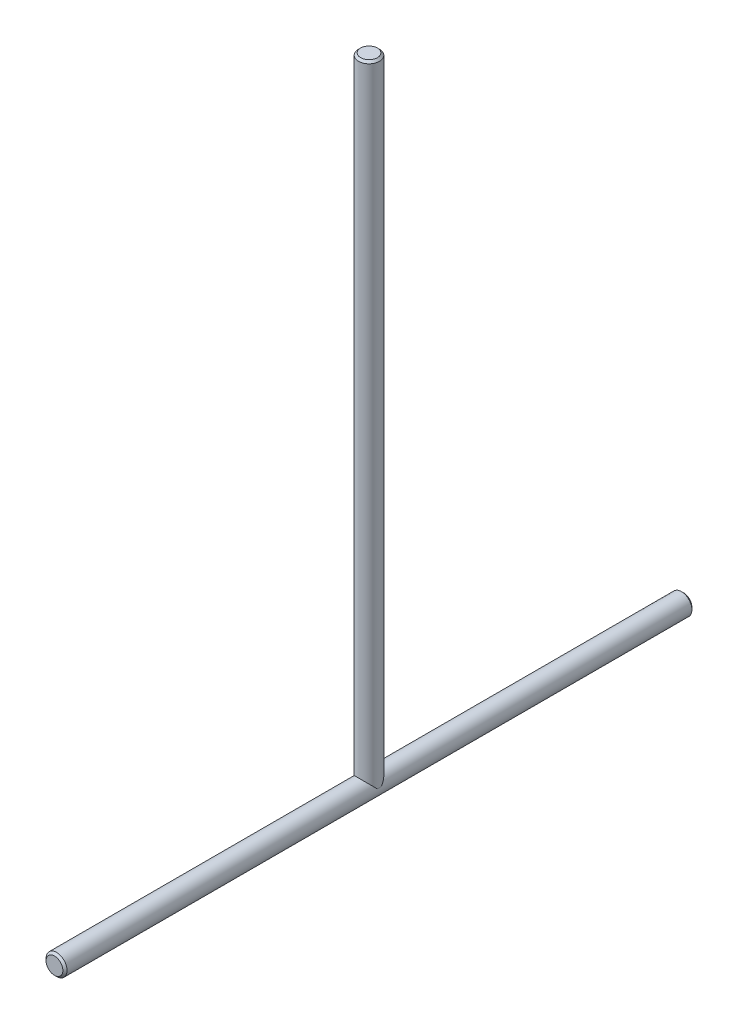
ISO-10303-21;
HEADER;
FILE_DESCRIPTION(('STEP AP214'),'2;1');
FILE_NAME('part.step','',(''),(''),'','','');
FILE_SCHEMA(('AUTOMOTIVE_DESIGN { 1 0 10303 214 1 1 1 1 }'));
ENDSEC;
DATA;
#1=APPLICATION_CONTEXT('core data for automotive mechanical design processes');
#2=APPLICATION_PROTOCOL_DEFINITION('international standard','automotive_design',2000,#1);
#3=PRODUCT_CONTEXT('',#1,'mechanical');
#4=PRODUCT('Part','Part','',(#3));
#5=PRODUCT_RELATED_PRODUCT_CATEGORY('part','',(#4));
#6=PRODUCT_DEFINITION_FORMATION('','',#4);
#7=PRODUCT_DEFINITION_CONTEXT('part definition',#1,'design');
#8=PRODUCT_DEFINITION('design','',#6,#7);
#9=PRODUCT_DEFINITION_SHAPE('','',#8);
#10=(LENGTH_UNIT() NAMED_UNIT(*) SI_UNIT(.MILLI.,.METRE.));
#11=(NAMED_UNIT(*) PLANE_ANGLE_UNIT() SI_UNIT($,.RADIAN.));
#12=(NAMED_UNIT(*) SI_UNIT($,.STERADIAN.) SOLID_ANGLE_UNIT());
#13=UNCERTAINTY_MEASURE_WITH_UNIT(LENGTH_MEASURE(1.E-05),#10,'distance_accuracy_value','');
#14=(GEOMETRIC_REPRESENTATION_CONTEXT(3) GLOBAL_UNCERTAINTY_ASSIGNED_CONTEXT((#13)) GLOBAL_UNIT_ASSIGNED_CONTEXT((#10,
#11,#12)) REPRESENTATION_CONTEXT('',''));
#15=CARTESIAN_POINT('',(0.,0.,0.));
#16=DIRECTION('',(0.,0.,1.));
#17=DIRECTION('',(1.,0.,0.));
#18=AXIS2_PLACEMENT_3D('',#15,#16,#17);
#19=CARTESIAN_POINT('',(0.,0.,0.));
#20=DIRECTION('',(0.,-1.,0.));
#21=DIRECTION('',(0.,0.,-1.));
#22=AXIS2_PLACEMENT_3D('',#19,#20,#21);
#23=CYLINDRICAL_SURFACE('',#22,4.99999999999999);
#24=CARTESIAN_POINT('',(0.,301.,0.));
#25=DIRECTION('',(0.,-1.,0.));
#26=DIRECTION('',(0.,0.,-1.));
#27=AXIS2_PLACEMENT_3D('',#24,#25,#26);
#28=CIRCLE('',#27,5.00000000000002);
#29=CARTESIAN_POINT('',(0.,301.,-5.00000000000002));
#30=VERTEX_POINT('',#29);
#31=EDGE_CURVE('E73',#30,#30,#28,.T.);
#32=ORIENTED_EDGE('',*,*,#31,.T.);
#33=EDGE_LOOP('',(#32));
#34=FACE_BOUND('',#33,.T.);
#35=CARTESIAN_POINT('',(0.,1.,0.));
#36=DIRECTION('',(0.,-1.,0.));
#37=DIRECTION('',(0.,0.,-1.));
#38=AXIS2_PLACEMENT_3D('',#35,#36,#37);
#39=CIRCLE('',#38,4.99999999999996);
#40=CARTESIAN_POINT('',(4.89897948556633,1.,-1.));
#41=VERTEX_POINT('',#40);
#42=CARTESIAN_POINT('',(4.89897948556633,1.,1.));
#43=VERTEX_POINT('',#42);
#44=EDGE_CURVE('E69',#41,#43,#39,.T.);
#45=ORIENTED_EDGE('',*,*,#44,.F.);
#46=CARTESIAN_POINT('',(0.,0.,0.));
#47=DIRECTION('',(0.,-0.707106781186547,-0.707106781186547));
#48=DIRECTION('',(0.,-0.707106781186547,0.707106781186547));
#49=AXIS2_PLACEMENT_3D('',#46,#47,#48);
#50=ELLIPSE('',#49,7.07106781186547,5.);
#51=CARTESIAN_POINT('',(-4.89897948556636,1.,-0.999999999999816));
#52=VERTEX_POINT('',#51);
#53=EDGE_CURVE('E52',#41,#52,#50,.F.);
#54=ORIENTED_EDGE('',*,*,#53,.T.);
#55=CARTESIAN_POINT('',(-4.89897948556636,1.,0.999999999999816));
#56=VERTEX_POINT('',#55);
#57=EDGE_CURVE('E67',#56,#52,#39,.T.);
#58=ORIENTED_EDGE('',*,*,#57,.F.);
#59=CARTESIAN_POINT('',(0.,0.,0.));
#60=DIRECTION('',(0.,-0.707106781186547,0.707106781186547));
#61=DIRECTION('',(0.,-0.707106781186547,-0.707106781186547));
#62=AXIS2_PLACEMENT_3D('',#59,#60,#61);
#63=ELLIPSE('',#62,7.07106781186547,5.);
#64=EDGE_CURVE('E47',#56,#43,#63,.F.);
#65=ORIENTED_EDGE('',*,*,#64,.T.);
#66=EDGE_LOOP('',(#45,#54,#58,#65));
#67=FACE_BOUND('',#66,.T.);
#68=ADVANCED_FACE('F32',(#34,#67),#23,.T.);
#69=CARTESIAN_POINT('',(0.,0.,0.));
#70=DIRECTION('',(0.,1.,0.));
#71=DIRECTION('',(0.,0.,1.));
#72=AXIS2_PLACEMENT_3D('',#69,#70,#71);
#73=CONICAL_SURFACE('',#72,3.99999999999997,0.785398163397446);
#74=ORIENTED_EDGE('',*,*,#44,.T.);
#75=CARTESIAN_POINT('',(4.87745424991357,1.10020000000002,1.49079847061895));
#76=CARTESIAN_POINT('',(4.88211559722487,1.07953217280684,1.40484180989072));
#77=CARTESIAN_POINT('',(4.88630399811169,1.06035627995717,1.31850437199833));
#78=CARTESIAN_POINT('',(4.89378874480552,1.02525776660876,1.14511017585227));
#79=CARTESIAN_POINT('',(4.89708485523737,1.00933600478034,1.05805323403131));
#80=CARTESIAN_POINT('',(4.90571535378677,0.966856273344412,0.795840807345466));
#81=CARTESIAN_POINT('',(4.90978700435332,0.945606699696971,0.619736392432964));
#82=CARTESIAN_POINT('',(4.91480123161804,0.919189776996474,0.270032854404587));
#83=CARTESIAN_POINT('',(4.91580821010439,0.91369157238792,0.0964595921330885));
#84=CARTESIAN_POINT('',(4.91495449459275,0.918275850826598,-0.250368988003878));
#85=CARTESIAN_POINT('',(4.91309596686564,0.928346564068938,-0.423624447010351));
#86=CARTESIAN_POINT('',(4.90827213698644,0.953369752381306,-0.671073171390941));
#87=CARTESIAN_POINT('',(4.90652484958276,0.962352257723393,-0.745947233075276));
#88=CARTESIAN_POINT('',(4.90243629319782,0.982970675049836,-0.895311289612724));
#89=CARTESIAN_POINT('',(4.90009507487671,0.994606360718969,-0.969801316669958));
#90=CARTESIAN_POINT('',(4.89476658555269,1.02050779519384,-1.11902541731952));
#91=CARTESIAN_POINT('',(4.8917733907918,1.03479746967753,-1.19375509139308));
#92=CARTESIAN_POINT('',(4.8851213416845,1.06575707574376,-1.34268562643545));
#93=CARTESIAN_POINT('',(4.8814625308798,1.08242685161504,-1.41688652166494));
#94=CARTESIAN_POINT('',(4.87745424991358,1.1002,-1.49079847061889));
#95=B_SPLINE_CURVE_WITH_KNOTS('',3,(#75,#76,#77,#78,#79,#80,#81,#82,#83,#84,#85,#86,#87,#88,#89,
#90,#91,#92,#93,#94),.UNSPECIFIED.,.F.,.F.,(4,2,2,2,2,2,2,2,2,4),(0.,0.26556121911636,
0.531192421882955,1.062740701676,1.58303896616567,2.102944087393,2.32920031111436,
2.55543724248506,2.7838225042531,3.01219283141514),.UNSPECIFIED.);
#96=EDGE_CURVE('E62',#43,#41,#95,.T.);
#97=ORIENTED_EDGE('',*,*,#96,.T.);
#98=EDGE_LOOP('',(#74,#97));
#99=FACE_BOUND('',#98,.T.);
#100=ADVANCED_FACE('F89',(#99),#73,.T.);
#101=ORIENTED_EDGE('',*,*,#57,.T.);
#102=CARTESIAN_POINT('',(-4.87745424991358,1.1002,-1.49079847061889));
#103=CARTESIAN_POINT('',(-4.88211559722487,1.07953217280683,-1.40484180989066));
#104=CARTESIAN_POINT('',(-4.88630399811169,1.06035627995715,-1.31850437199826));
#105=CARTESIAN_POINT('',(-4.89378874480552,1.02525776660875,-1.14511017585221));
#106=CARTESIAN_POINT('',(-4.89708485523737,1.00933600478033,-1.05805323403125));
#107=CARTESIAN_POINT('',(-4.90571535378678,0.966856273344404,-0.795840807345409));
#108=CARTESIAN_POINT('',(-4.90978700435332,0.945606699696964,-0.619736392432908));
#109=CARTESIAN_POINT('',(-4.91480123161804,0.919189776996472,-0.270032854404534));
#110=CARTESIAN_POINT('',(-4.91580821010439,0.91369157238792,-0.0964595921330372));
#111=CARTESIAN_POINT('',(-4.91495449459275,0.9182758508266,0.250368988003926));
#112=CARTESIAN_POINT('',(-4.91309596686564,0.92834656406894,0.423624447010397));
#113=CARTESIAN_POINT('',(-4.90827213698644,0.95336975238131,0.671073171390987));
#114=CARTESIAN_POINT('',(-4.90652484958276,0.962352257723399,0.745947233075324));
#115=CARTESIAN_POINT('',(-4.90243629319782,0.982970675049844,0.895311289612774));
#116=CARTESIAN_POINT('',(-4.90009507487671,0.994606360718978,0.96980131667001));
#117=CARTESIAN_POINT('',(-4.89476658555269,1.02050779519385,1.11902541731958));
#118=CARTESIAN_POINT('',(-4.8917733907918,1.03479746967754,1.19375509139314));
#119=CARTESIAN_POINT('',(-4.88512134168449,1.06575707574377,1.34268562643551));
#120=CARTESIAN_POINT('',(-4.8814625308798,1.08242685161505,1.41688652166501));
#121=CARTESIAN_POINT('',(-4.87745424991357,1.10020000000002,1.49079847061896));
#122=B_SPLINE_CURVE_WITH_KNOTS('',3,(#102,#103,#104,#105,#106,#107,#108,#109,#110,#111,#112,
#113,#114,#115,#116,#117,#118,#119,#120,#121),.UNSPECIFIED.,.F.,.F.,(4,2,2,2,2,2,2,2,2,4),(0.,
0.265561219116357,0.531192421882949,1.06274070167599,1.58303896616566,2.10294408739298,
2.32920031111435,2.55543724248505,2.7838225042531,3.01219283141514),.UNSPECIFIED.);
#123=EDGE_CURVE('E57',#52,#56,#122,.T.);
#124=ORIENTED_EDGE('',*,*,#123,.T.);
#125=EDGE_LOOP('',(#101,#124));
#126=FACE_BOUND('',#125,.T.);
#127=ADVANCED_FACE('F71',(#126),#73,.T.);
#128=CARTESIAN_POINT('',(0.,302.,0.));
#129=DIRECTION('',(0.,1.,0.));
#130=DIRECTION('',(0.,0.,1.));
#131=AXIS2_PLACEMENT_3D('',#128,#129,#130);
#132=PLANE('',#131);
#133=CARTESIAN_POINT('',(0.,302.,0.));
#134=DIRECTION('',(0.,-1.,0.));
#135=DIRECTION('',(0.,0.,-1.));
#136=AXIS2_PLACEMENT_3D('',#133,#134,#135);
#137=CIRCLE('',#136,4.00000000000002);
#138=CARTESIAN_POINT('',(0.,302.,-4.00000000000002));
#139=VERTEX_POINT('',#138);
#140=EDGE_CURVE('E63',#139,#139,#137,.T.);
#141=ORIENTED_EDGE('',*,*,#140,.F.);
#142=EDGE_LOOP('',(#141));
#143=FACE_BOUND('',#142,.T.);
#144=ADVANCED_FACE('F118',(#143),#132,.T.);
#145=CARTESIAN_POINT('',(0.,301.,0.));
#146=DIRECTION('',(0.,-1.,0.));
#147=DIRECTION('',(0.,0.,-1.));
#148=AXIS2_PLACEMENT_3D('',#145,#146,#147);
#149=CONICAL_SURFACE('',#148,5.00000000000002,0.785398163397448);
#150=ORIENTED_EDGE('',*,*,#140,.T.);
#151=EDGE_LOOP('',(#150));
#152=FACE_BOUND('',#151,.T.);
#153=ORIENTED_EDGE('',*,*,#31,.F.);
#154=EDGE_LOOP('',(#153));
#155=FACE_BOUND('',#154,.T.);
#156=ADVANCED_FACE('F96',(#152,#155),#149,.T.);
#157=CARTESIAN_POINT('',(0.,0.,150.));
#158=DIRECTION('',(0.,0.,-1.));
#159=DIRECTION('',(-1.,0.,0.));
#160=AXIS2_PLACEMENT_3D('',#157,#158,#159);
#161=CYLINDRICAL_SURFACE('',#160,5.);
#162=CARTESIAN_POINT('',(0.,0.,149.));
#163=DIRECTION('',(0.,0.,1.));
#164=DIRECTION('',(1.,0.,0.));
#165=AXIS2_PLACEMENT_3D('',#162,#163,#164);
#166=CIRCLE('',#165,5.);
#167=CARTESIAN_POINT('',(5.,0.,149.));
#168=VERTEX_POINT('',#167);
#169=EDGE_CURVE('E40',#168,#168,#166,.F.);
#170=ORIENTED_EDGE('',*,*,#169,.T.);
#171=EDGE_LOOP('',(#170));
#172=FACE_BOUND('',#171,.T.);
#173=CARTESIAN_POINT('',(0.,0.,-149.));
#174=DIRECTION('',(0.,0.,1.));
#175=DIRECTION('',(1.,0.,0.));
#176=AXIS2_PLACEMENT_3D('',#173,#174,#175);
#177=CIRCLE('',#176,5.);
#178=CARTESIAN_POINT('',(5.,0.,-149.));
#179=VERTEX_POINT('',#178);
#180=EDGE_CURVE('E133',#179,#179,#177,.T.);
#181=ORIENTED_EDGE('',*,*,#180,.T.);
#182=EDGE_LOOP('',(#181));
#183=FACE_BOUND('',#182,.T.);
#184=ORIENTED_EDGE('',*,*,#96,.F.);
#185=ORIENTED_EDGE('',*,*,#64,.F.);
#186=ORIENTED_EDGE('',*,*,#123,.F.);
#187=ORIENTED_EDGE('',*,*,#53,.F.);
#188=EDGE_LOOP('',(#184,#185,#186,#187));
#189=FACE_BOUND('',#188,.T.);
#190=ADVANCED_FACE('F58',(#172,#183,#189),#161,.T.);
#191=CARTESIAN_POINT('',(0.,0.,150.));
#192=DIRECTION('',(0.,0.,1.));
#193=DIRECTION('',(1.,0.,0.));
#194=AXIS2_PLACEMENT_3D('',#191,#192,#193);
#195=PLANE('',#194);
#196=CARTESIAN_POINT('',(0.,0.,150.));
#197=DIRECTION('',(0.,0.,1.));
#198=DIRECTION('',(1.,0.,0.));
#199=AXIS2_PLACEMENT_3D('',#196,#197,#198);
#200=CIRCLE('',#199,3.99999999999995);
#201=CARTESIAN_POINT('',(3.99999999999995,0.,150.));
#202=VERTEX_POINT('',#201);
#203=EDGE_CURVE('E132',#202,#202,#200,.T.);
#204=ORIENTED_EDGE('',*,*,#203,.T.);
#205=EDGE_LOOP('',(#204));
#206=FACE_BOUND('',#205,.T.);
#207=ADVANCED_FACE('F95',(#206),#195,.T.);
#208=CARTESIAN_POINT('',(0.,0.,-150.));
#209=DIRECTION('',(0.,0.,1.));
#210=DIRECTION('',(1.,0.,0.));
#211=AXIS2_PLACEMENT_3D('',#208,#209,#210);
#212=PLANE('',#211);
#213=CARTESIAN_POINT('',(0.,0.,-150.));
#214=DIRECTION('',(0.,0.,1.));
#215=DIRECTION('',(1.,0.,0.));
#216=AXIS2_PLACEMENT_3D('',#213,#214,#215);
#217=CIRCLE('',#216,3.99999999999989);
#218=CARTESIAN_POINT('',(3.99999999999989,0.,-150.));
#219=VERTEX_POINT('',#218);
#220=EDGE_CURVE('E11',#219,#219,#217,.F.);
#221=ORIENTED_EDGE('',*,*,#220,.T.);
#222=EDGE_LOOP('',(#221));
#223=FACE_BOUND('',#222,.T.);
#224=ADVANCED_FACE('F98',(#223),#212,.F.);
#225=CARTESIAN_POINT('',(0.,0.,150.));
#226=DIRECTION('',(0.,0.,-1.));
#227=DIRECTION('',(-1.,0.,0.));
#228=AXIS2_PLACEMENT_3D('',#225,#226,#227);
#229=CONICAL_SURFACE('',#228,3.99999999999995,0.785398163397474);
#230=ORIENTED_EDGE('',*,*,#169,.F.);
#231=EDGE_LOOP('',(#230));
#232=FACE_BOUND('',#231,.T.);
#233=ORIENTED_EDGE('',*,*,#203,.F.);
#234=EDGE_LOOP('',(#233));
#235=FACE_BOUND('',#234,.T.);
#236=ADVANCED_FACE('F102',(#232,#235),#229,.T.);
#237=CARTESIAN_POINT('',(0.,0.,-149.));
#238=DIRECTION('',(0.,0.,1.));
#239=DIRECTION('',(1.,0.,0.));
#240=AXIS2_PLACEMENT_3D('',#237,#238,#239);
#241=CONICAL_SURFACE('',#240,5.,0.785398163397446);
#242=ORIENTED_EDGE('',*,*,#220,.F.);
#243=EDGE_LOOP('',(#242));
#244=FACE_BOUND('',#243,.T.);
#245=ORIENTED_EDGE('',*,*,#180,.F.);
#246=EDGE_LOOP('',(#245));
#247=FACE_BOUND('',#246,.T.);
#248=ADVANCED_FACE('F34',(#244,#247),#241,.T.);
#249=CLOSED_SHELL('',(#68,#100,#127,#144,#156,#190,#207,#224,#236,#248));
#250=MANIFOLD_SOLID_BREP('B2',#249);
#251=ADVANCED_BREP_SHAPE_REPRESENTATION('',(#18,#250),#14);
#252=SHAPE_DEFINITION_REPRESENTATION(#9,#251);
ENDSEC;
END-ISO-10303-21;
